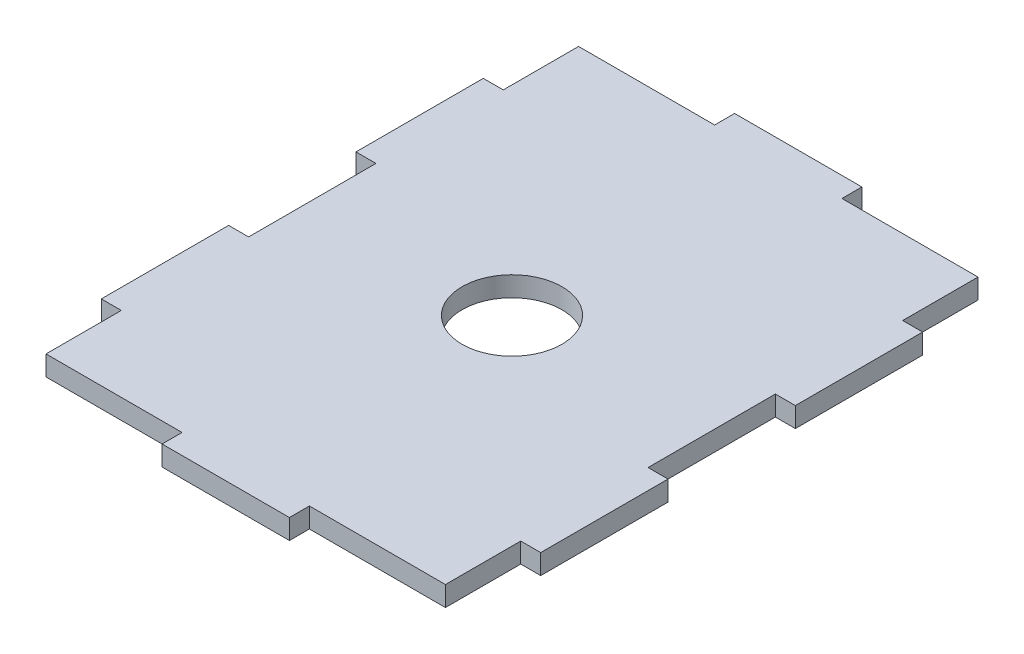
ISO-10303-21;
HEADER;
FILE_DESCRIPTION(('STEP AP214'),'2;1');
FILE_NAME('part.step','',(''),(''),'','','');
FILE_SCHEMA(('AUTOMOTIVE_DESIGN { 1 0 10303 214 1 1 1 1 }'));
ENDSEC;
DATA;
#1=APPLICATION_CONTEXT('core data for automotive mechanical design processes');
#2=APPLICATION_PROTOCOL_DEFINITION('international standard','automotive_design',2000,#1);
#3=PRODUCT_CONTEXT('',#1,'mechanical');
#4=PRODUCT('Part','Part','',(#3));
#5=PRODUCT_RELATED_PRODUCT_CATEGORY('part','',(#4));
#6=PRODUCT_DEFINITION_FORMATION('','',#4);
#7=PRODUCT_DEFINITION_CONTEXT('part definition',#1,'design');
#8=PRODUCT_DEFINITION('design','',#6,#7);
#9=PRODUCT_DEFINITION_SHAPE('','',#8);
#10=(LENGTH_UNIT() NAMED_UNIT(*) SI_UNIT(.MILLI.,.METRE.));
#11=(NAMED_UNIT(*) PLANE_ANGLE_UNIT() SI_UNIT($,.RADIAN.));
#12=(NAMED_UNIT(*) SI_UNIT($,.STERADIAN.) SOLID_ANGLE_UNIT());
#13=UNCERTAINTY_MEASURE_WITH_UNIT(LENGTH_MEASURE(1.E-05),#10,'distance_accuracy_value','');
#14=(GEOMETRIC_REPRESENTATION_CONTEXT(3) GLOBAL_UNCERTAINTY_ASSIGNED_CONTEXT((#13)) GLOBAL_UNIT_ASSIGNED_CONTEXT((#10,
#11,#12)) REPRESENTATION_CONTEXT('',''));
#15=CARTESIAN_POINT('',(0.,0.,0.));
#16=DIRECTION('',(0.,0.,1.));
#17=DIRECTION('',(1.,0.,0.));
#18=AXIS2_PLACEMENT_3D('',#15,#16,#17);
#19=CARTESIAN_POINT('',(0.,3.,0.));
#20=DIRECTION('',(0.,1.,0.));
#21=DIRECTION('',(0.,0.,1.));
#22=AXIS2_PLACEMENT_3D('',#19,#20,#21);
#23=PLANE('',#22);
#24=DIRECTION('',(-1.,0.,0.));
#25=VECTOR('',#24,1.);
#26=CARTESIAN_POINT('',(-12.5730819339896,3.,10.7732061286201));
#27=LINE('',#26,#25);
#28=CARTESIAN_POINT('',(6.55191806601041,3.,10.7732061286201));
#29=VERTEX_POINT('',#28);
#30=CARTESIAN_POINT('',(-13.8855819339896,3.,10.7732061286201));
#31=VERTEX_POINT('',#30);
#32=EDGE_CURVE('E52',#29,#31,#27,.T.);
#33=ORIENTED_EDGE('',*,*,#32,.T.);
#34=DIRECTION('',(0.,0.,1.));
#35=VECTOR('',#34,1.);
#36=CARTESIAN_POINT('',(-13.8855819339896,3.,10.7732061286201));
#37=LINE('',#36,#35);
#38=CARTESIAN_POINT('',(-13.8855819339896,3.,22.0857061286201));
#39=VERTEX_POINT('',#38);
#40=EDGE_CURVE('E156',#31,#39,#37,.T.);
#41=ORIENTED_EDGE('',*,*,#40,.T.);
#42=DIRECTION('',(-1.,0.,0.));
#43=VECTOR('',#42,1.);
#44=CARTESIAN_POINT('',(-13.8855819339896,3.,22.0857061286201));
#45=LINE('',#44,#43);
#46=CARTESIAN_POINT('',(-16.8855819339896,3.,22.0857061286201));
#47=VERTEX_POINT('',#46);
#48=EDGE_CURVE('E385',#39,#47,#45,.T.);
#49=ORIENTED_EDGE('',*,*,#48,.T.);
#50=DIRECTION('',(0.,0.,1.));
#51=VECTOR('',#50,1.);
#52=CARTESIAN_POINT('',(-16.8855819339896,3.,22.0857061286201));
#53=LINE('',#52,#51);
#54=CARTESIAN_POINT('',(-16.8855819339896,3.,41.2107061286201));
#55=VERTEX_POINT('',#54);
#56=EDGE_CURVE('E405',#47,#55,#53,.T.);
#57=ORIENTED_EDGE('',*,*,#56,.T.);
#58=DIRECTION('',(1.,0.,0.));
#59=VECTOR('',#58,1.);
#60=CARTESIAN_POINT('',(-16.8855819339896,3.,41.2107061286201));
#61=LINE('',#60,#59);
#62=CARTESIAN_POINT('',(-13.8855819339896,3.,41.2107061286201));
#63=VERTEX_POINT('',#62);
#64=EDGE_CURVE('E402',#55,#63,#61,.T.);
#65=ORIENTED_EDGE('',*,*,#64,.T.);
#66=DIRECTION('',(0.,0.,1.));
#67=VECTOR('',#66,1.);
#68=CARTESIAN_POINT('',(-13.8855819339896,3.,41.2107061286201));
#69=LINE('',#68,#67);
#70=CARTESIAN_POINT('',(-13.8855819339896,3.,60.3357061286201));
#71=VERTEX_POINT('',#70);
#72=EDGE_CURVE('E404',#63,#71,#69,.T.);
#73=ORIENTED_EDGE('',*,*,#72,.T.);
#74=DIRECTION('',(-1.,0.,0.));
#75=VECTOR('',#74,1.);
#76=CARTESIAN_POINT('',(-13.8855819339896,3.,60.3357061286201));
#77=LINE('',#76,#75);
#78=CARTESIAN_POINT('',(-16.8855819339896,3.,60.3357061286201));
#79=VERTEX_POINT('',#78);
#80=EDGE_CURVE('E407',#71,#79,#77,.T.);
#81=ORIENTED_EDGE('',*,*,#80,.T.);
#82=DIRECTION('',(0.,0.,1.));
#83=VECTOR('',#82,1.);
#84=CARTESIAN_POINT('',(-16.8855819339896,3.,60.3357061286201));
#85=LINE('',#84,#83);
#86=CARTESIAN_POINT('',(-16.8855819339896,3.,79.4607061286201));
#87=VERTEX_POINT('',#86);
#88=EDGE_CURVE('E413',#79,#87,#85,.T.);
#89=ORIENTED_EDGE('',*,*,#88,.T.);
#90=DIRECTION('',(1.,0.,0.));
#91=VECTOR('',#90,1.);
#92=CARTESIAN_POINT('',(-16.8855819339896,3.,79.4607061286201));
#93=LINE('',#92,#91);
#94=CARTESIAN_POINT('',(-13.8855819339896,3.,79.4607061286201));
#95=VERTEX_POINT('',#94);
#96=EDGE_CURVE('E415',#87,#95,#93,.T.);
#97=ORIENTED_EDGE('',*,*,#96,.T.);
#98=DIRECTION('',(0.,0.,1.));
#99=VECTOR('',#98,1.);
#100=CARTESIAN_POINT('',(-13.8855819339896,3.,79.4607061286201));
#101=LINE('',#100,#99);
#102=CARTESIAN_POINT('',(-13.8855819339896,3.,90.7732061286201));
#103=VERTEX_POINT('',#102);
#104=EDGE_CURVE('E417',#95,#103,#101,.T.);
#105=ORIENTED_EDGE('',*,*,#104,.T.);
#106=DIRECTION('',(1.,0.,0.));
#107=VECTOR('',#106,1.);
#108=CARTESIAN_POINT('',(-13.8855819339896,3.,90.7732061286201));
#109=LINE('',#108,#107);
#110=CARTESIAN_POINT('',(6.55191806601041,3.,90.7732061286201));
#111=VERTEX_POINT('',#110);
#112=EDGE_CURVE('E419',#103,#111,#109,.T.);
#113=ORIENTED_EDGE('',*,*,#112,.T.);
#114=DIRECTION('',(0.,0.,1.));
#115=VECTOR('',#114,1.);
#116=CARTESIAN_POINT('',(6.55191806601041,3.,90.7732061286201));
#117=LINE('',#116,#115);
#118=CARTESIAN_POINT('',(6.55191806601041,3.,93.7732061286201));
#119=VERTEX_POINT('',#118);
#120=EDGE_CURVE('E421',#111,#119,#117,.T.);
#121=ORIENTED_EDGE('',*,*,#120,.T.);
#122=DIRECTION('',(1.,0.,0.));
#123=VECTOR('',#122,1.);
#124=CARTESIAN_POINT('',(6.55191806601041,3.,93.7732061286201));
#125=LINE('',#124,#123);
#126=CARTESIAN_POINT('',(25.6769180660104,3.,93.7732061286201));
#127=VERTEX_POINT('',#126);
#128=EDGE_CURVE('E423',#119,#127,#125,.T.);
#129=ORIENTED_EDGE('',*,*,#128,.T.);
#130=DIRECTION('',(0.,0.,-1.));
#131=VECTOR('',#130,1.);
#132=CARTESIAN_POINT('',(25.6769180660104,3.,93.7732061286201));
#133=LINE('',#132,#131);
#134=CARTESIAN_POINT('',(25.6769180660104,3.,90.7732061286201));
#135=VERTEX_POINT('',#134);
#136=EDGE_CURVE('E425',#127,#135,#133,.T.);
#137=ORIENTED_EDGE('',*,*,#136,.T.);
#138=DIRECTION('',(1.,0.,0.));
#139=VECTOR('',#138,1.);
#140=CARTESIAN_POINT('',(25.6769180660104,3.,90.7732061286201));
#141=LINE('',#140,#139);
#142=CARTESIAN_POINT('',(46.1144180660104,3.,90.7732061286201));
#143=VERTEX_POINT('',#142);
#144=EDGE_CURVE('E427',#135,#143,#141,.T.);
#145=ORIENTED_EDGE('',*,*,#144,.T.);
#146=DIRECTION('',(0.,0.,-1.));
#147=VECTOR('',#146,1.);
#148=CARTESIAN_POINT('',(46.1144180660104,3.,90.7732061286201));
#149=LINE('',#148,#147);
#150=CARTESIAN_POINT('',(46.1144180660104,3.,79.4607061286201));
#151=VERTEX_POINT('',#150);
#152=EDGE_CURVE('E429',#143,#151,#149,.T.);
#153=ORIENTED_EDGE('',*,*,#152,.T.);
#154=DIRECTION('',(1.,0.,0.));
#155=VECTOR('',#154,1.);
#156=CARTESIAN_POINT('',(46.1144180660104,3.,79.4607061286201));
#157=LINE('',#156,#155);
#158=CARTESIAN_POINT('',(49.1144180660104,3.,79.4607061286201));
#159=VERTEX_POINT('',#158);
#160=EDGE_CURVE('E431',#151,#159,#157,.T.);
#161=ORIENTED_EDGE('',*,*,#160,.T.);
#162=DIRECTION('',(0.,0.,-1.));
#163=VECTOR('',#162,1.);
#164=CARTESIAN_POINT('',(49.1144180660104,3.,79.4607061286201));
#165=LINE('',#164,#163);
#166=CARTESIAN_POINT('',(49.1144180660104,3.,60.3357061286201));
#167=VERTEX_POINT('',#166);
#168=EDGE_CURVE('E433',#159,#167,#165,.T.);
#169=ORIENTED_EDGE('',*,*,#168,.T.);
#170=DIRECTION('',(-1.,0.,0.));
#171=VECTOR('',#170,1.);
#172=CARTESIAN_POINT('',(49.1144180660104,3.,60.3357061286201));
#173=LINE('',#172,#171);
#174=CARTESIAN_POINT('',(46.1144180660104,3.,60.3357061286201));
#175=VERTEX_POINT('',#174);
#176=EDGE_CURVE('E435',#167,#175,#173,.T.);
#177=ORIENTED_EDGE('',*,*,#176,.T.);
#178=DIRECTION('',(0.,0.,-1.));
#179=VECTOR('',#178,1.);
#180=CARTESIAN_POINT('',(46.1144180660104,3.,60.3357061286201));
#181=LINE('',#180,#179);
#182=CARTESIAN_POINT('',(46.1144180660104,3.,41.2107061286201));
#183=VERTEX_POINT('',#182);
#184=EDGE_CURVE('E437',#175,#183,#181,.T.);
#185=ORIENTED_EDGE('',*,*,#184,.T.);
#186=DIRECTION('',(1.,0.,0.));
#187=VECTOR('',#186,1.);
#188=CARTESIAN_POINT('',(46.1144180660104,3.,41.2107061286201));
#189=LINE('',#188,#187);
#190=CARTESIAN_POINT('',(49.1144180660104,3.,41.2107061286201));
#191=VERTEX_POINT('',#190);
#192=EDGE_CURVE('E439',#183,#191,#189,.T.);
#193=ORIENTED_EDGE('',*,*,#192,.T.);
#194=DIRECTION('',(0.,0.,-1.));
#195=VECTOR('',#194,1.);
#196=CARTESIAN_POINT('',(49.1144180660104,3.,41.2107061286201));
#197=LINE('',#196,#195);
#198=CARTESIAN_POINT('',(49.1144180660104,3.,22.0857061286201));
#199=VERTEX_POINT('',#198);
#200=EDGE_CURVE('E441',#191,#199,#197,.T.);
#201=ORIENTED_EDGE('',*,*,#200,.T.);
#202=DIRECTION('',(-1.,0.,0.));
#203=VECTOR('',#202,1.);
#204=CARTESIAN_POINT('',(49.1144180660104,3.,22.0857061286201));
#205=LINE('',#204,#203);
#206=CARTESIAN_POINT('',(46.1144180660104,3.,22.0857061286201));
#207=VERTEX_POINT('',#206);
#208=EDGE_CURVE('E443',#199,#207,#205,.T.);
#209=ORIENTED_EDGE('',*,*,#208,.T.);
#210=DIRECTION('',(0.,0.,-1.));
#211=VECTOR('',#210,1.);
#212=CARTESIAN_POINT('',(46.1144180660104,3.,22.0857061286201));
#213=LINE('',#212,#211);
#214=CARTESIAN_POINT('',(46.1144180660104,3.,10.7732061286201));
#215=VERTEX_POINT('',#214);
#216=EDGE_CURVE('E445',#207,#215,#213,.T.);
#217=ORIENTED_EDGE('',*,*,#216,.T.);
#218=DIRECTION('',(-1.,0.,0.));
#219=VECTOR('',#218,1.);
#220=CARTESIAN_POINT('',(46.1144180660104,3.,10.7732061286201));
#221=LINE('',#220,#219);
#222=CARTESIAN_POINT('',(25.6769180660104,3.,10.7732061286201));
#223=VERTEX_POINT('',#222);
#224=EDGE_CURVE('E236',#215,#223,#221,.T.);
#225=ORIENTED_EDGE('',*,*,#224,.T.);
#226=DIRECTION('',(0.,0.,-1.));
#227=VECTOR('',#226,1.);
#228=CARTESIAN_POINT('',(25.6769180660104,3.,10.7732061286201));
#229=LINE('',#228,#227);
#230=CARTESIAN_POINT('',(25.6769180660104,3.,7.77320612862015));
#231=VERTEX_POINT('',#230);
#232=EDGE_CURVE('E230',#223,#231,#229,.T.);
#233=ORIENTED_EDGE('',*,*,#232,.T.);
#234=DIRECTION('',(-1.,0.,0.));
#235=VECTOR('',#234,1.);
#236=CARTESIAN_POINT('',(25.6769180660104,3.,7.77320612862015));
#237=LINE('',#236,#235);
#238=CARTESIAN_POINT('',(6.55191806601041,3.,7.77320612862015));
#239=VERTEX_POINT('',#238);
#240=EDGE_CURVE('E234',#231,#239,#237,.T.);
#241=ORIENTED_EDGE('',*,*,#240,.T.);
#242=DIRECTION('',(0.,0.,1.));
#243=VECTOR('',#242,1.);
#244=CARTESIAN_POINT('',(6.55191806601041,3.,7.77320612862015));
#245=LINE('',#244,#243);
#246=EDGE_CURVE('E250',#239,#29,#245,.T.);
#247=ORIENTED_EDGE('',*,*,#246,.T.);
#248=EDGE_LOOP('',(#33,#41,#49,#57,#65,#73,#81,#89,#97,#105,#113,#121,#129,#137,#145,#153,#161,
#169,#177,#185,#193,#201,#209,#217,#225,#233,#241,#247));
#249=FACE_BOUND('',#248,.T.);
#250=CARTESIAN_POINT('',(16.1144180660104,3.,50.7732061286201));
#251=DIRECTION('',(0.,1.,0.));
#252=DIRECTION('',(0.,0.,1.));
#253=AXIS2_PLACEMENT_3D('',#250,#251,#252);
#254=CIRCLE('',#253,7.5);
#255=CARTESIAN_POINT('',(16.1144180660104,3.,58.2732061286201));
#256=VERTEX_POINT('',#255);
#257=EDGE_CURVE('E259',#256,#256,#254,.T.);
#258=ORIENTED_EDGE('',*,*,#257,.F.);
#259=EDGE_LOOP('',(#258));
#260=FACE_BOUND('',#259,.T.);
#261=ADVANCED_FACE('F35',(#249,#260),#23,.T.);
#262=CARTESIAN_POINT('',(0.,0.,0.));
#263=DIRECTION('',(0.,1.,0.));
#264=DIRECTION('',(0.,0.,1.));
#265=AXIS2_PLACEMENT_3D('',#262,#263,#264);
#266=PLANE('',#265);
#267=DIRECTION('',(0.,0.,1.));
#268=VECTOR('',#267,1.);
#269=CARTESIAN_POINT('',(-13.8855819339896,0.,10.7732061286201));
#270=LINE('',#269,#268);
#271=CARTESIAN_POINT('',(-13.8855819339896,0.,10.7732061286201));
#272=VERTEX_POINT('',#271);
#273=CARTESIAN_POINT('',(-13.8855819339896,0.,22.0857061286201));
#274=VERTEX_POINT('',#273);
#275=EDGE_CURVE('E256',#272,#274,#270,.T.);
#276=ORIENTED_EDGE('',*,*,#275,.F.);
#277=DIRECTION('',(-1.,0.,0.));
#278=VECTOR('',#277,1.);
#279=CARTESIAN_POINT('',(6.55191806601041,0.,10.7732061286201));
#280=LINE('',#279,#278);
#281=CARTESIAN_POINT('',(6.55191806601041,0.,10.7732061286201));
#282=VERTEX_POINT('',#281);
#283=EDGE_CURVE('E309',#282,#272,#280,.T.);
#284=ORIENTED_EDGE('',*,*,#283,.F.);
#285=DIRECTION('',(0.,0.,1.));
#286=VECTOR('',#285,1.);
#287=CARTESIAN_POINT('',(6.55191806601041,0.,7.77320612862015));
#288=LINE('',#287,#286);
#289=CARTESIAN_POINT('',(6.55191806601041,0.,7.77320612862015));
#290=VERTEX_POINT('',#289);
#291=EDGE_CURVE('E149',#290,#282,#288,.T.);
#292=ORIENTED_EDGE('',*,*,#291,.F.);
#293=DIRECTION('',(-1.,0.,0.));
#294=VECTOR('',#293,1.);
#295=CARTESIAN_POINT('',(25.6769180660104,0.,7.77320612862015));
#296=LINE('',#295,#294);
#297=CARTESIAN_POINT('',(25.6769180660104,0.,7.77320612862015));
#298=VERTEX_POINT('',#297);
#299=EDGE_CURVE('E142',#298,#290,#296,.T.);
#300=ORIENTED_EDGE('',*,*,#299,.F.);
#301=DIRECTION('',(0.,0.,-1.));
#302=VECTOR('',#301,1.);
#303=CARTESIAN_POINT('',(25.6769180660104,0.,10.7732061286201));
#304=LINE('',#303,#302);
#305=CARTESIAN_POINT('',(25.6769180660104,0.,10.7732061286201));
#306=VERTEX_POINT('',#305);
#307=EDGE_CURVE('E244',#306,#298,#304,.T.);
#308=ORIENTED_EDGE('',*,*,#307,.F.);
#309=DIRECTION('',(-1.,0.,0.));
#310=VECTOR('',#309,1.);
#311=CARTESIAN_POINT('',(46.1144180660104,0.,10.7732061286201));
#312=LINE('',#311,#310);
#313=CARTESIAN_POINT('',(46.1144180660104,0.,10.7732061286201));
#314=VERTEX_POINT('',#313);
#315=EDGE_CURVE('E304',#314,#306,#312,.T.);
#316=ORIENTED_EDGE('',*,*,#315,.F.);
#317=DIRECTION('',(0.,0.,-1.));
#318=VECTOR('',#317,1.);
#319=CARTESIAN_POINT('',(46.1144180660104,0.,22.0857061286201));
#320=LINE('',#319,#318);
#321=CARTESIAN_POINT('',(46.1144180660104,0.,22.0857061286201));
#322=VERTEX_POINT('',#321);
#323=EDGE_CURVE('E302',#322,#314,#320,.T.);
#324=ORIENTED_EDGE('',*,*,#323,.F.);
#325=DIRECTION('',(-1.,0.,0.));
#326=VECTOR('',#325,1.);
#327=CARTESIAN_POINT('',(49.1144180660104,0.,22.0857061286201));
#328=LINE('',#327,#326);
#329=CARTESIAN_POINT('',(49.1144180660104,0.,22.0857061286201));
#330=VERTEX_POINT('',#329);
#331=EDGE_CURVE('E300',#330,#322,#328,.T.);
#332=ORIENTED_EDGE('',*,*,#331,.F.);
#333=DIRECTION('',(0.,0.,-1.));
#334=VECTOR('',#333,1.);
#335=CARTESIAN_POINT('',(49.1144180660104,0.,41.2107061286201));
#336=LINE('',#335,#334);
#337=CARTESIAN_POINT('',(49.1144180660104,0.,41.2107061286201));
#338=VERTEX_POINT('',#337);
#339=EDGE_CURVE('E298',#338,#330,#336,.T.);
#340=ORIENTED_EDGE('',*,*,#339,.F.);
#341=DIRECTION('',(1.,0.,0.));
#342=VECTOR('',#341,1.);
#343=CARTESIAN_POINT('',(46.1144180660104,0.,41.2107061286201));
#344=LINE('',#343,#342);
#345=CARTESIAN_POINT('',(46.1144180660104,0.,41.2107061286201));
#346=VERTEX_POINT('',#345);
#347=EDGE_CURVE('E296',#346,#338,#344,.T.);
#348=ORIENTED_EDGE('',*,*,#347,.F.);
#349=DIRECTION('',(0.,0.,-1.));
#350=VECTOR('',#349,1.);
#351=CARTESIAN_POINT('',(46.1144180660104,0.,60.3357061286201));
#352=LINE('',#351,#350);
#353=CARTESIAN_POINT('',(46.1144180660104,0.,60.3357061286201));
#354=VERTEX_POINT('',#353);
#355=EDGE_CURVE('E294',#354,#346,#352,.T.);
#356=ORIENTED_EDGE('',*,*,#355,.F.);
#357=DIRECTION('',(-1.,0.,0.));
#358=VECTOR('',#357,1.);
#359=CARTESIAN_POINT('',(49.1144180660104,0.,60.3357061286201));
#360=LINE('',#359,#358);
#361=CARTESIAN_POINT('',(49.1144180660104,0.,60.3357061286201));
#362=VERTEX_POINT('',#361);
#363=EDGE_CURVE('E292',#362,#354,#360,.T.);
#364=ORIENTED_EDGE('',*,*,#363,.F.);
#365=DIRECTION('',(0.,0.,-1.));
#366=VECTOR('',#365,1.);
#367=CARTESIAN_POINT('',(49.1144180660104,0.,79.4607061286201));
#368=LINE('',#367,#366);
#369=CARTESIAN_POINT('',(49.1144180660104,0.,79.4607061286201));
#370=VERTEX_POINT('',#369);
#371=EDGE_CURVE('E290',#370,#362,#368,.T.);
#372=ORIENTED_EDGE('',*,*,#371,.F.);
#373=DIRECTION('',(1.,0.,0.));
#374=VECTOR('',#373,1.);
#375=CARTESIAN_POINT('',(46.1144180660104,0.,79.4607061286201));
#376=LINE('',#375,#374);
#377=CARTESIAN_POINT('',(46.1144180660104,0.,79.4607061286201));
#378=VERTEX_POINT('',#377);
#379=EDGE_CURVE('E288',#378,#370,#376,.T.);
#380=ORIENTED_EDGE('',*,*,#379,.F.);
#381=DIRECTION('',(0.,0.,-1.));
#382=VECTOR('',#381,1.);
#383=CARTESIAN_POINT('',(46.1144180660104,0.,90.7732061286201));
#384=LINE('',#383,#382);
#385=CARTESIAN_POINT('',(46.1144180660104,0.,90.7732061286201));
#386=VERTEX_POINT('',#385);
#387=EDGE_CURVE('E286',#386,#378,#384,.T.);
#388=ORIENTED_EDGE('',*,*,#387,.F.);
#389=DIRECTION('',(1.,0.,0.));
#390=VECTOR('',#389,1.);
#391=CARTESIAN_POINT('',(44.8019180660104,0.,90.7732061286201));
#392=LINE('',#391,#390);
#393=CARTESIAN_POINT('',(25.6769180660104,0.,90.7732061286201));
#394=VERTEX_POINT('',#393);
#395=EDGE_CURVE('E284',#394,#386,#392,.T.);
#396=ORIENTED_EDGE('',*,*,#395,.F.);
#397=DIRECTION('',(0.,0.,-1.));
#398=VECTOR('',#397,1.);
#399=CARTESIAN_POINT('',(25.6769180660104,0.,93.7732061286201));
#400=LINE('',#399,#398);
#401=CARTESIAN_POINT('',(25.6769180660104,0.,93.7732061286201));
#402=VERTEX_POINT('',#401);
#403=EDGE_CURVE('E281',#402,#394,#400,.T.);
#404=ORIENTED_EDGE('',*,*,#403,.F.);
#405=DIRECTION('',(1.,0.,0.));
#406=VECTOR('',#405,1.);
#407=CARTESIAN_POINT('',(6.55191806601041,0.,93.7732061286201));
#408=LINE('',#407,#406);
#409=CARTESIAN_POINT('',(6.55191806601041,0.,93.7732061286201));
#410=VERTEX_POINT('',#409);
#411=EDGE_CURVE('E279',#410,#402,#408,.T.);
#412=ORIENTED_EDGE('',*,*,#411,.F.);
#413=DIRECTION('',(0.,0.,1.));
#414=VECTOR('',#413,1.);
#415=CARTESIAN_POINT('',(6.55191806601041,0.,90.7732061286201));
#416=LINE('',#415,#414);
#417=CARTESIAN_POINT('',(6.55191806601041,0.,90.7732061286201));
#418=VERTEX_POINT('',#417);
#419=EDGE_CURVE('E277',#418,#410,#416,.T.);
#420=ORIENTED_EDGE('',*,*,#419,.F.);
#421=DIRECTION('',(1.,0.,0.));
#422=VECTOR('',#421,1.);
#423=CARTESIAN_POINT('',(-13.8855819339896,0.,90.7732061286201));
#424=LINE('',#423,#422);
#425=CARTESIAN_POINT('',(-13.8855819339896,0.,90.7732061286201));
#426=VERTEX_POINT('',#425);
#427=EDGE_CURVE('E275',#426,#418,#424,.T.);
#428=ORIENTED_EDGE('',*,*,#427,.F.);
#429=DIRECTION('',(0.,0.,1.));
#430=VECTOR('',#429,1.);
#431=CARTESIAN_POINT('',(-13.8855819339896,0.,79.4607061286201));
#432=LINE('',#431,#430);
#433=CARTESIAN_POINT('',(-13.8855819339896,0.,79.4607061286201));
#434=VERTEX_POINT('',#433);
#435=EDGE_CURVE('E273',#434,#426,#432,.T.);
#436=ORIENTED_EDGE('',*,*,#435,.F.);
#437=DIRECTION('',(1.,0.,0.));
#438=VECTOR('',#437,1.);
#439=CARTESIAN_POINT('',(-16.8855819339896,0.,79.4607061286201));
#440=LINE('',#439,#438);
#441=CARTESIAN_POINT('',(-16.8855819339896,0.,79.4607061286201));
#442=VERTEX_POINT('',#441);
#443=EDGE_CURVE('E271',#442,#434,#440,.T.);
#444=ORIENTED_EDGE('',*,*,#443,.F.);
#445=DIRECTION('',(0.,0.,1.));
#446=VECTOR('',#445,1.);
#447=CARTESIAN_POINT('',(-16.8855819339896,0.,60.3357061286201));
#448=LINE('',#447,#446);
#449=CARTESIAN_POINT('',(-16.8855819339896,0.,60.3357061286201));
#450=VERTEX_POINT('',#449);
#451=EDGE_CURVE('E269',#450,#442,#448,.T.);
#452=ORIENTED_EDGE('',*,*,#451,.F.);
#453=DIRECTION('',(-1.,0.,0.));
#454=VECTOR('',#453,1.);
#455=CARTESIAN_POINT('',(-13.8855819339896,0.,60.3357061286201));
#456=LINE('',#455,#454);
#457=CARTESIAN_POINT('',(-13.8855819339896,0.,60.3357061286201));
#458=VERTEX_POINT('',#457);
#459=EDGE_CURVE('E267',#458,#450,#456,.T.);
#460=ORIENTED_EDGE('',*,*,#459,.F.);
#461=DIRECTION('',(0.,0.,1.));
#462=VECTOR('',#461,1.);
#463=CARTESIAN_POINT('',(-13.8855819339896,0.,41.2107061286201));
#464=LINE('',#463,#462);
#465=CARTESIAN_POINT('',(-13.8855819339896,0.,41.2107061286201));
#466=VERTEX_POINT('',#465);
#467=EDGE_CURVE('E265',#466,#458,#464,.T.);
#468=ORIENTED_EDGE('',*,*,#467,.F.);
#469=DIRECTION('',(1.,0.,0.));
#470=VECTOR('',#469,1.);
#471=CARTESIAN_POINT('',(-16.8855819339896,0.,41.2107061286201));
#472=LINE('',#471,#470);
#473=CARTESIAN_POINT('',(-16.8855819339896,0.,41.2107061286201));
#474=VERTEX_POINT('',#473);
#475=EDGE_CURVE('E263',#474,#466,#472,.T.);
#476=ORIENTED_EDGE('',*,*,#475,.F.);
#477=DIRECTION('',(0.,0.,1.));
#478=VECTOR('',#477,1.);
#479=CARTESIAN_POINT('',(-16.8855819339896,0.,22.0857061286201));
#480=LINE('',#479,#478);
#481=CARTESIAN_POINT('',(-16.8855819339896,0.,22.0857061286201));
#482=VERTEX_POINT('',#481);
#483=EDGE_CURVE('E261',#482,#474,#480,.T.);
#484=ORIENTED_EDGE('',*,*,#483,.F.);
#485=DIRECTION('',(-1.,0.,0.));
#486=VECTOR('',#485,1.);
#487=CARTESIAN_POINT('',(-13.8855819339896,0.,22.0857061286201));
#488=LINE('',#487,#486);
#489=EDGE_CURVE('E258',#274,#482,#488,.T.);
#490=ORIENTED_EDGE('',*,*,#489,.F.);
#491=EDGE_LOOP('',(#276,#284,#292,#300,#308,#316,#324,#332,#340,#348,#356,#364,#372,#380,#388,
#396,#404,#412,#420,#428,#436,#444,#452,#460,#468,#476,#484,#490));
#492=FACE_BOUND('',#491,.T.);
#493=CARTESIAN_POINT('',(16.1144180660104,0.,50.7732061286201));
#494=DIRECTION('',(0.,1.,0.));
#495=DIRECTION('',(0.,0.,1.));
#496=AXIS2_PLACEMENT_3D('',#493,#494,#495);
#497=CIRCLE('',#496,7.5);
#498=CARTESIAN_POINT('',(16.1144180660104,0.,58.2732061286201));
#499=VERTEX_POINT('',#498);
#500=EDGE_CURVE('E461',#499,#499,#497,.T.);
#501=ORIENTED_EDGE('',*,*,#500,.T.);
#502=EDGE_LOOP('',(#501));
#503=FACE_BOUND('',#502,.T.);
#504=ADVANCED_FACE('F389',(#492,#503),#266,.F.);
#505=CARTESIAN_POINT('',(-13.8855819339896,3.,10.7732061286201));
#506=DIRECTION('',(1.,0.,0.));
#507=DIRECTION('',(0.,0.,-1.));
#508=AXIS2_PLACEMENT_3D('',#505,#506,#507);
#509=PLANE('',#508);
#510=ORIENTED_EDGE('',*,*,#275,.T.);
#511=DIRECTION('',(0.,-1.,0.));
#512=VECTOR('',#511,1.);
#513=CARTESIAN_POINT('',(-13.8855819339896,3.,22.0857061286201));
#514=LINE('',#513,#512);
#515=EDGE_CURVE('E44',#39,#274,#514,.T.);
#516=ORIENTED_EDGE('',*,*,#515,.F.);
#517=ORIENTED_EDGE('',*,*,#40,.F.);
#518=DIRECTION('',(0.,-1.,0.));
#519=VECTOR('',#518,1.);
#520=CARTESIAN_POINT('',(-13.8855819339896,3.,10.7732061286201));
#521=LINE('',#520,#519);
#522=EDGE_CURVE('E11',#31,#272,#521,.T.);
#523=ORIENTED_EDGE('',*,*,#522,.T.);
#524=EDGE_LOOP('',(#510,#516,#517,#523));
#525=FACE_BOUND('',#524,.T.);
#526=ADVANCED_FACE('F37',(#525),#509,.F.);
#527=CARTESIAN_POINT('',(-13.8855819339896,3.,22.0857061286201));
#528=DIRECTION('',(0.,0.,1.));
#529=DIRECTION('',(1.,0.,0.));
#530=AXIS2_PLACEMENT_3D('',#527,#528,#529);
#531=PLANE('',#530);
#532=ORIENTED_EDGE('',*,*,#489,.T.);
#533=DIRECTION('',(0.,-1.,0.));
#534=VECTOR('',#533,1.);
#535=CARTESIAN_POINT('',(-16.8855819339896,3.,22.0857061286201));
#536=LINE('',#535,#534);
#537=EDGE_CURVE('E377',#47,#482,#536,.T.);
#538=ORIENTED_EDGE('',*,*,#537,.F.);
#539=ORIENTED_EDGE('',*,*,#48,.F.);
#540=ORIENTED_EDGE('',*,*,#515,.T.);
#541=EDGE_LOOP('',(#532,#538,#539,#540));
#542=FACE_BOUND('',#541,.T.);
#543=ADVANCED_FACE('F383',(#542),#531,.F.);
#544=CARTESIAN_POINT('',(-16.8855819339896,3.,22.0857061286201));
#545=DIRECTION('',(1.,0.,0.));
#546=DIRECTION('',(0.,0.,-1.));
#547=AXIS2_PLACEMENT_3D('',#544,#545,#546);
#548=PLANE('',#547);
#549=ORIENTED_EDGE('',*,*,#483,.T.);
#550=DIRECTION('',(0.,-1.,0.));
#551=VECTOR('',#550,1.);
#552=CARTESIAN_POINT('',(-16.8855819339896,3.,41.2107061286201));
#553=LINE('',#552,#551);
#554=EDGE_CURVE('E374',#55,#474,#553,.T.);
#555=ORIENTED_EDGE('',*,*,#554,.F.);
#556=ORIENTED_EDGE('',*,*,#56,.F.);
#557=ORIENTED_EDGE('',*,*,#537,.T.);
#558=EDGE_LOOP('',(#549,#555,#556,#557));
#559=FACE_BOUND('',#558,.T.);
#560=ADVANCED_FACE('F396',(#559),#548,.F.);
#561=CARTESIAN_POINT('',(-16.8855819339896,3.,41.2107061286201));
#562=DIRECTION('',(0.,0.,-1.));
#563=DIRECTION('',(-1.,0.,0.));
#564=AXIS2_PLACEMENT_3D('',#561,#562,#563);
#565=PLANE('',#564);
#566=ORIENTED_EDGE('',*,*,#475,.T.);
#567=DIRECTION('',(0.,-1.,0.));
#568=VECTOR('',#567,1.);
#569=CARTESIAN_POINT('',(-13.8855819339896,3.,41.2107061286201));
#570=LINE('',#569,#568);
#571=EDGE_CURVE('E371',#63,#466,#570,.T.);
#572=ORIENTED_EDGE('',*,*,#571,.F.);
#573=ORIENTED_EDGE('',*,*,#64,.F.);
#574=ORIENTED_EDGE('',*,*,#554,.T.);
#575=EDGE_LOOP('',(#566,#572,#573,#574));
#576=FACE_BOUND('',#575,.T.);
#577=ADVANCED_FACE('F400',(#576),#565,.F.);
#578=CARTESIAN_POINT('',(-13.8855819339896,3.,41.2107061286201));
#579=DIRECTION('',(1.,0.,0.));
#580=DIRECTION('',(0.,0.,-1.));
#581=AXIS2_PLACEMENT_3D('',#578,#579,#580);
#582=PLANE('',#581);
#583=ORIENTED_EDGE('',*,*,#467,.T.);
#584=DIRECTION('',(0.,-1.,0.));
#585=VECTOR('',#584,1.);
#586=CARTESIAN_POINT('',(-13.8855819339896,3.,60.3357061286201));
#587=LINE('',#586,#585);
#588=EDGE_CURVE('E368',#71,#458,#587,.T.);
#589=ORIENTED_EDGE('',*,*,#588,.F.);
#590=ORIENTED_EDGE('',*,*,#72,.F.);
#591=ORIENTED_EDGE('',*,*,#571,.T.);
#592=EDGE_LOOP('',(#583,#589,#590,#591));
#593=FACE_BOUND('',#592,.T.);
#594=ADVANCED_FACE('F556',(#593),#582,.F.);
#595=CARTESIAN_POINT('',(-13.8855819339896,3.,60.3357061286201));
#596=DIRECTION('',(0.,0.,1.));
#597=DIRECTION('',(1.,0.,0.));
#598=AXIS2_PLACEMENT_3D('',#595,#596,#597);
#599=PLANE('',#598);
#600=ORIENTED_EDGE('',*,*,#459,.T.);
#601=DIRECTION('',(0.,-1.,0.));
#602=VECTOR('',#601,1.);
#603=CARTESIAN_POINT('',(-16.8855819339896,3.,60.3357061286201));
#604=LINE('',#603,#602);
#605=EDGE_CURVE('E365',#79,#450,#604,.T.);
#606=ORIENTED_EDGE('',*,*,#605,.F.);
#607=ORIENTED_EDGE('',*,*,#80,.F.);
#608=ORIENTED_EDGE('',*,*,#588,.T.);
#609=EDGE_LOOP('',(#600,#606,#607,#608));
#610=FACE_BOUND('',#609,.T.);
#611=ADVANCED_FACE('F552',(#610),#599,.F.);
#612=CARTESIAN_POINT('',(-16.8855819339896,3.,60.3357061286201));
#613=DIRECTION('',(1.,0.,0.));
#614=DIRECTION('',(0.,0.,-1.));
#615=AXIS2_PLACEMENT_3D('',#612,#613,#614);
#616=PLANE('',#615);
#617=ORIENTED_EDGE('',*,*,#451,.T.);
#618=DIRECTION('',(0.,-1.,0.));
#619=VECTOR('',#618,1.);
#620=CARTESIAN_POINT('',(-16.8855819339896,3.,79.4607061286201));
#621=LINE('',#620,#619);
#622=EDGE_CURVE('E362',#87,#442,#621,.T.);
#623=ORIENTED_EDGE('',*,*,#622,.F.);
#624=ORIENTED_EDGE('',*,*,#88,.F.);
#625=ORIENTED_EDGE('',*,*,#605,.T.);
#626=EDGE_LOOP('',(#617,#623,#624,#625));
#627=FACE_BOUND('',#626,.T.);
#628=ADVANCED_FACE('F548',(#627),#616,.F.);
#629=CARTESIAN_POINT('',(-16.8855819339896,3.,79.4607061286201));
#630=DIRECTION('',(0.,0.,-1.));
#631=DIRECTION('',(-1.,0.,0.));
#632=AXIS2_PLACEMENT_3D('',#629,#630,#631);
#633=PLANE('',#632);
#634=ORIENTED_EDGE('',*,*,#443,.T.);
#635=DIRECTION('',(0.,-1.,0.));
#636=VECTOR('',#635,1.);
#637=CARTESIAN_POINT('',(-13.8855819339896,3.,79.4607061286201));
#638=LINE('',#637,#636);
#639=EDGE_CURVE('E359',#95,#434,#638,.T.);
#640=ORIENTED_EDGE('',*,*,#639,.F.);
#641=ORIENTED_EDGE('',*,*,#96,.F.);
#642=ORIENTED_EDGE('',*,*,#622,.T.);
#643=EDGE_LOOP('',(#634,#640,#641,#642));
#644=FACE_BOUND('',#643,.T.);
#645=ADVANCED_FACE('F544',(#644),#633,.F.);
#646=CARTESIAN_POINT('',(-13.8855819339896,3.,79.4607061286201));
#647=DIRECTION('',(1.,0.,0.));
#648=DIRECTION('',(0.,0.,-1.));
#649=AXIS2_PLACEMENT_3D('',#646,#647,#648);
#650=PLANE('',#649);
#651=ORIENTED_EDGE('',*,*,#435,.T.);
#652=DIRECTION('',(0.,-1.,0.));
#653=VECTOR('',#652,1.);
#654=CARTESIAN_POINT('',(-13.8855819339896,3.,90.7732061286201));
#655=LINE('',#654,#653);
#656=EDGE_CURVE('E356',#103,#426,#655,.T.);
#657=ORIENTED_EDGE('',*,*,#656,.F.);
#658=ORIENTED_EDGE('',*,*,#104,.F.);
#659=ORIENTED_EDGE('',*,*,#639,.T.);
#660=EDGE_LOOP('',(#651,#657,#658,#659));
#661=FACE_BOUND('',#660,.T.);
#662=ADVANCED_FACE('F540',(#661),#650,.F.);
#663=CARTESIAN_POINT('',(-13.8855819339896,3.,90.7732061286201));
#664=DIRECTION('',(0.,0.,-1.));
#665=DIRECTION('',(-1.,0.,0.));
#666=AXIS2_PLACEMENT_3D('',#663,#664,#665);
#667=PLANE('',#666);
#668=ORIENTED_EDGE('',*,*,#427,.T.);
#669=DIRECTION('',(0.,-1.,0.));
#670=VECTOR('',#669,1.);
#671=CARTESIAN_POINT('',(6.55191806601041,3.,90.7732061286201));
#672=LINE('',#671,#670);
#673=EDGE_CURVE('E353',#111,#418,#672,.T.);
#674=ORIENTED_EDGE('',*,*,#673,.F.);
#675=ORIENTED_EDGE('',*,*,#112,.F.);
#676=ORIENTED_EDGE('',*,*,#656,.T.);
#677=EDGE_LOOP('',(#668,#674,#675,#676));
#678=FACE_BOUND('',#677,.T.);
#679=ADVANCED_FACE('F536',(#678),#667,.F.);
#680=CARTESIAN_POINT('',(6.55191806601041,3.,90.7732061286201));
#681=DIRECTION('',(1.,0.,0.));
#682=DIRECTION('',(0.,0.,-1.));
#683=AXIS2_PLACEMENT_3D('',#680,#681,#682);
#684=PLANE('',#683);
#685=ORIENTED_EDGE('',*,*,#419,.T.);
#686=DIRECTION('',(0.,-1.,0.));
#687=VECTOR('',#686,1.);
#688=CARTESIAN_POINT('',(6.55191806601041,3.,93.7732061286201));
#689=LINE('',#688,#687);
#690=EDGE_CURVE('E350',#119,#410,#689,.T.);
#691=ORIENTED_EDGE('',*,*,#690,.F.);
#692=ORIENTED_EDGE('',*,*,#120,.F.);
#693=ORIENTED_EDGE('',*,*,#673,.T.);
#694=EDGE_LOOP('',(#685,#691,#692,#693));
#695=FACE_BOUND('',#694,.T.);
#696=ADVANCED_FACE('F532',(#695),#684,.F.);
#697=CARTESIAN_POINT('',(6.55191806601041,3.,93.7732061286201));
#698=DIRECTION('',(0.,0.,-1.));
#699=DIRECTION('',(-1.,0.,0.));
#700=AXIS2_PLACEMENT_3D('',#697,#698,#699);
#701=PLANE('',#700);
#702=ORIENTED_EDGE('',*,*,#411,.T.);
#703=DIRECTION('',(0.,-1.,0.));
#704=VECTOR('',#703,1.);
#705=CARTESIAN_POINT('',(25.6769180660104,3.,93.7732061286201));
#706=LINE('',#705,#704);
#707=EDGE_CURVE('E347',#127,#402,#706,.T.);
#708=ORIENTED_EDGE('',*,*,#707,.F.);
#709=ORIENTED_EDGE('',*,*,#128,.F.);
#710=ORIENTED_EDGE('',*,*,#690,.T.);
#711=EDGE_LOOP('',(#702,#708,#709,#710));
#712=FACE_BOUND('',#711,.T.);
#713=ADVANCED_FACE('F528',(#712),#701,.F.);
#714=CARTESIAN_POINT('',(25.6769180660104,3.,93.7732061286201));
#715=DIRECTION('',(-1.,0.,0.));
#716=DIRECTION('',(0.,0.,1.));
#717=AXIS2_PLACEMENT_3D('',#714,#715,#716);
#718=PLANE('',#717);
#719=ORIENTED_EDGE('',*,*,#403,.T.);
#720=DIRECTION('',(0.,-1.,0.));
#721=VECTOR('',#720,1.);
#722=CARTESIAN_POINT('',(25.6769180660104,3.,90.7732061286201));
#723=LINE('',#722,#721);
#724=EDGE_CURVE('E344',#135,#394,#723,.T.);
#725=ORIENTED_EDGE('',*,*,#724,.F.);
#726=ORIENTED_EDGE('',*,*,#136,.F.);
#727=ORIENTED_EDGE('',*,*,#707,.T.);
#728=EDGE_LOOP('',(#719,#725,#726,#727));
#729=FACE_BOUND('',#728,.T.);
#730=ADVANCED_FACE('F524',(#729),#718,.F.);
#731=CARTESIAN_POINT('',(44.8019180660104,3.,90.7732061286201));
#732=DIRECTION('',(0.,0.,-1.));
#733=DIRECTION('',(-1.,0.,0.));
#734=AXIS2_PLACEMENT_3D('',#731,#732,#733);
#735=PLANE('',#734);
#736=ORIENTED_EDGE('',*,*,#395,.T.);
#737=DIRECTION('',(0.,-1.,0.));
#738=VECTOR('',#737,1.);
#739=CARTESIAN_POINT('',(46.1144180660104,3.,90.7732061286201));
#740=LINE('',#739,#738);
#741=EDGE_CURVE('E341',#143,#386,#740,.T.);
#742=ORIENTED_EDGE('',*,*,#741,.F.);
#743=ORIENTED_EDGE('',*,*,#144,.F.);
#744=ORIENTED_EDGE('',*,*,#724,.T.);
#745=EDGE_LOOP('',(#736,#742,#743,#744));
#746=FACE_BOUND('',#745,.T.);
#747=ADVANCED_FACE('F520',(#746),#735,.F.);
#748=CARTESIAN_POINT('',(46.1144180660104,3.,90.7732061286201));
#749=DIRECTION('',(-1.,0.,0.));
#750=DIRECTION('',(0.,0.,1.));
#751=AXIS2_PLACEMENT_3D('',#748,#749,#750);
#752=PLANE('',#751);
#753=ORIENTED_EDGE('',*,*,#387,.T.);
#754=DIRECTION('',(0.,-1.,0.));
#755=VECTOR('',#754,1.);
#756=CARTESIAN_POINT('',(46.1144180660104,3.,79.4607061286201));
#757=LINE('',#756,#755);
#758=EDGE_CURVE('E338',#151,#378,#757,.T.);
#759=ORIENTED_EDGE('',*,*,#758,.F.);
#760=ORIENTED_EDGE('',*,*,#152,.F.);
#761=ORIENTED_EDGE('',*,*,#741,.T.);
#762=EDGE_LOOP('',(#753,#759,#760,#761));
#763=FACE_BOUND('',#762,.T.);
#764=ADVANCED_FACE('F516',(#763),#752,.F.);
#765=CARTESIAN_POINT('',(46.1144180660104,3.,79.4607061286201));
#766=DIRECTION('',(0.,0.,-1.));
#767=DIRECTION('',(-1.,0.,0.));
#768=AXIS2_PLACEMENT_3D('',#765,#766,#767);
#769=PLANE('',#768);
#770=ORIENTED_EDGE('',*,*,#379,.T.);
#771=DIRECTION('',(0.,-1.,0.));
#772=VECTOR('',#771,1.);
#773=CARTESIAN_POINT('',(49.1144180660104,3.,79.4607061286201));
#774=LINE('',#773,#772);
#775=EDGE_CURVE('E335',#159,#370,#774,.T.);
#776=ORIENTED_EDGE('',*,*,#775,.F.);
#777=ORIENTED_EDGE('',*,*,#160,.F.);
#778=ORIENTED_EDGE('',*,*,#758,.T.);
#779=EDGE_LOOP('',(#770,#776,#777,#778));
#780=FACE_BOUND('',#779,.T.);
#781=ADVANCED_FACE('F512',(#780),#769,.F.);
#782=CARTESIAN_POINT('',(49.1144180660104,3.,79.4607061286201));
#783=DIRECTION('',(-1.,0.,0.));
#784=DIRECTION('',(0.,0.,1.));
#785=AXIS2_PLACEMENT_3D('',#782,#783,#784);
#786=PLANE('',#785);
#787=ORIENTED_EDGE('',*,*,#371,.T.);
#788=DIRECTION('',(0.,-1.,0.));
#789=VECTOR('',#788,1.);
#790=CARTESIAN_POINT('',(49.1144180660104,3.,60.3357061286201));
#791=LINE('',#790,#789);
#792=EDGE_CURVE('E332',#167,#362,#791,.T.);
#793=ORIENTED_EDGE('',*,*,#792,.F.);
#794=ORIENTED_EDGE('',*,*,#168,.F.);
#795=ORIENTED_EDGE('',*,*,#775,.T.);
#796=EDGE_LOOP('',(#787,#793,#794,#795));
#797=FACE_BOUND('',#796,.T.);
#798=ADVANCED_FACE('F508',(#797),#786,.F.);
#799=CARTESIAN_POINT('',(49.1144180660104,3.,60.3357061286201));
#800=DIRECTION('',(0.,0.,1.));
#801=DIRECTION('',(1.,0.,0.));
#802=AXIS2_PLACEMENT_3D('',#799,#800,#801);
#803=PLANE('',#802);
#804=ORIENTED_EDGE('',*,*,#363,.T.);
#805=DIRECTION('',(0.,-1.,0.));
#806=VECTOR('',#805,1.);
#807=CARTESIAN_POINT('',(46.1144180660104,3.,60.3357061286201));
#808=LINE('',#807,#806);
#809=EDGE_CURVE('E329',#175,#354,#808,.T.);
#810=ORIENTED_EDGE('',*,*,#809,.F.);
#811=ORIENTED_EDGE('',*,*,#176,.F.);
#812=ORIENTED_EDGE('',*,*,#792,.T.);
#813=EDGE_LOOP('',(#804,#810,#811,#812));
#814=FACE_BOUND('',#813,.T.);
#815=ADVANCED_FACE('F504',(#814),#803,.F.);
#816=CARTESIAN_POINT('',(46.1144180660104,3.,60.3357061286201));
#817=DIRECTION('',(-1.,0.,0.));
#818=DIRECTION('',(0.,0.,1.));
#819=AXIS2_PLACEMENT_3D('',#816,#817,#818);
#820=PLANE('',#819);
#821=ORIENTED_EDGE('',*,*,#355,.T.);
#822=DIRECTION('',(0.,-1.,0.));
#823=VECTOR('',#822,1.);
#824=CARTESIAN_POINT('',(46.1144180660104,3.,41.2107061286201));
#825=LINE('',#824,#823);
#826=EDGE_CURVE('E326',#183,#346,#825,.T.);
#827=ORIENTED_EDGE('',*,*,#826,.F.);
#828=ORIENTED_EDGE('',*,*,#184,.F.);
#829=ORIENTED_EDGE('',*,*,#809,.T.);
#830=EDGE_LOOP('',(#821,#827,#828,#829));
#831=FACE_BOUND('',#830,.T.);
#832=ADVANCED_FACE('F500',(#831),#820,.F.);
#833=CARTESIAN_POINT('',(46.1144180660104,3.,41.2107061286201));
#834=DIRECTION('',(0.,0.,-1.));
#835=DIRECTION('',(-1.,0.,0.));
#836=AXIS2_PLACEMENT_3D('',#833,#834,#835);
#837=PLANE('',#836);
#838=ORIENTED_EDGE('',*,*,#347,.T.);
#839=DIRECTION('',(0.,-1.,0.));
#840=VECTOR('',#839,1.);
#841=CARTESIAN_POINT('',(49.1144180660104,3.,41.2107061286201));
#842=LINE('',#841,#840);
#843=EDGE_CURVE('E323',#191,#338,#842,.T.);
#844=ORIENTED_EDGE('',*,*,#843,.F.);
#845=ORIENTED_EDGE('',*,*,#192,.F.);
#846=ORIENTED_EDGE('',*,*,#826,.T.);
#847=EDGE_LOOP('',(#838,#844,#845,#846));
#848=FACE_BOUND('',#847,.T.);
#849=ADVANCED_FACE('F496',(#848),#837,.F.);
#850=CARTESIAN_POINT('',(49.1144180660104,3.,41.2107061286201));
#851=DIRECTION('',(-1.,0.,0.));
#852=DIRECTION('',(0.,0.,1.));
#853=AXIS2_PLACEMENT_3D('',#850,#851,#852);
#854=PLANE('',#853);
#855=ORIENTED_EDGE('',*,*,#339,.T.);
#856=DIRECTION('',(0.,-1.,0.));
#857=VECTOR('',#856,1.);
#858=CARTESIAN_POINT('',(49.1144180660104,3.,22.0857061286201));
#859=LINE('',#858,#857);
#860=EDGE_CURVE('E320',#199,#330,#859,.T.);
#861=ORIENTED_EDGE('',*,*,#860,.F.);
#862=ORIENTED_EDGE('',*,*,#200,.F.);
#863=ORIENTED_EDGE('',*,*,#843,.T.);
#864=EDGE_LOOP('',(#855,#861,#862,#863));
#865=FACE_BOUND('',#864,.T.);
#866=ADVANCED_FACE('F492',(#865),#854,.F.);
#867=CARTESIAN_POINT('',(49.1144180660104,3.,22.0857061286201));
#868=DIRECTION('',(0.,0.,1.));
#869=DIRECTION('',(1.,0.,0.));
#870=AXIS2_PLACEMENT_3D('',#867,#868,#869);
#871=PLANE('',#870);
#872=ORIENTED_EDGE('',*,*,#331,.T.);
#873=DIRECTION('',(0.,-1.,0.));
#874=VECTOR('',#873,1.);
#875=CARTESIAN_POINT('',(46.1144180660104,3.,22.0857061286201));
#876=LINE('',#875,#874);
#877=EDGE_CURVE('E317',#207,#322,#876,.T.);
#878=ORIENTED_EDGE('',*,*,#877,.F.);
#879=ORIENTED_EDGE('',*,*,#208,.F.);
#880=ORIENTED_EDGE('',*,*,#860,.T.);
#881=EDGE_LOOP('',(#872,#878,#879,#880));
#882=FACE_BOUND('',#881,.T.);
#883=ADVANCED_FACE('F489',(#882),#871,.F.);
#884=CARTESIAN_POINT('',(46.1144180660104,3.,22.0857061286201));
#885=DIRECTION('',(-1.,0.,0.));
#886=DIRECTION('',(0.,0.,1.));
#887=AXIS2_PLACEMENT_3D('',#884,#885,#886);
#888=PLANE('',#887);
#889=ORIENTED_EDGE('',*,*,#323,.T.);
#890=DIRECTION('',(0.,-1.,0.));
#891=VECTOR('',#890,1.);
#892=CARTESIAN_POINT('',(46.1144180660104,3.,10.7732061286201));
#893=LINE('',#892,#891);
#894=EDGE_CURVE('E314',#215,#314,#893,.T.);
#895=ORIENTED_EDGE('',*,*,#894,.F.);
#896=ORIENTED_EDGE('',*,*,#216,.F.);
#897=ORIENTED_EDGE('',*,*,#877,.T.);
#898=EDGE_LOOP('',(#889,#895,#896,#897));
#899=FACE_BOUND('',#898,.T.);
#900=ADVANCED_FACE('F451',(#899),#888,.F.);
#901=CARTESIAN_POINT('',(46.1144180660104,3.,10.7732061286201));
#902=DIRECTION('',(0.,0.,1.));
#903=DIRECTION('',(1.,0.,0.));
#904=AXIS2_PLACEMENT_3D('',#901,#902,#903);
#905=PLANE('',#904);
#906=ORIENTED_EDGE('',*,*,#315,.T.);
#907=DIRECTION('',(0.,-1.,0.));
#908=VECTOR('',#907,1.);
#909=CARTESIAN_POINT('',(25.6769180660104,3.,10.7732061286201));
#910=LINE('',#909,#908);
#911=EDGE_CURVE('E245',#223,#306,#910,.T.);
#912=ORIENTED_EDGE('',*,*,#911,.F.);
#913=ORIENTED_EDGE('',*,*,#224,.F.);
#914=ORIENTED_EDGE('',*,*,#894,.T.);
#915=EDGE_LOOP('',(#906,#912,#913,#914));
#916=FACE_BOUND('',#915,.T.);
#917=ADVANCED_FACE('F455',(#916),#905,.F.);
#918=CARTESIAN_POINT('',(25.6769180660104,3.,10.7732061286201));
#919=DIRECTION('',(-1.,0.,0.));
#920=DIRECTION('',(0.,0.,1.));
#921=AXIS2_PLACEMENT_3D('',#918,#919,#920);
#922=PLANE('',#921);
#923=ORIENTED_EDGE('',*,*,#307,.T.);
#924=DIRECTION('',(0.,-1.,0.));
#925=VECTOR('',#924,1.);
#926=CARTESIAN_POINT('',(25.6769180660104,3.,7.77320612862015));
#927=LINE('',#926,#925);
#928=EDGE_CURVE('E241',#231,#298,#927,.T.);
#929=ORIENTED_EDGE('',*,*,#928,.F.);
#930=ORIENTED_EDGE('',*,*,#232,.F.);
#931=ORIENTED_EDGE('',*,*,#911,.T.);
#932=EDGE_LOOP('',(#923,#929,#930,#931));
#933=FACE_BOUND('',#932,.T.);
#934=ADVANCED_FACE('F242',(#933),#922,.F.);
#935=CARTESIAN_POINT('',(25.6769180660104,3.,7.77320612862015));
#936=DIRECTION('',(0.,0.,1.));
#937=DIRECTION('',(1.,0.,0.));
#938=AXIS2_PLACEMENT_3D('',#935,#936,#937);
#939=PLANE('',#938);
#940=ORIENTED_EDGE('',*,*,#299,.T.);
#941=DIRECTION('',(0.,-1.,0.));
#942=VECTOR('',#941,1.);
#943=CARTESIAN_POINT('',(6.55191806601041,3.,7.77320612862015));
#944=LINE('',#943,#942);
#945=EDGE_CURVE('E246',#239,#290,#944,.T.);
#946=ORIENTED_EDGE('',*,*,#945,.F.);
#947=ORIENTED_EDGE('',*,*,#240,.F.);
#948=ORIENTED_EDGE('',*,*,#928,.T.);
#949=EDGE_LOOP('',(#940,#946,#947,#948));
#950=FACE_BOUND('',#949,.T.);
#951=ADVANCED_FACE('F248',(#950),#939,.F.);
#952=CARTESIAN_POINT('',(6.55191806601041,3.,7.77320612862015));
#953=DIRECTION('',(1.,0.,0.));
#954=DIRECTION('',(0.,0.,-1.));
#955=AXIS2_PLACEMENT_3D('',#952,#953,#954);
#956=PLANE('',#955);
#957=ORIENTED_EDGE('',*,*,#291,.T.);
#958=DIRECTION('',(0.,-1.,0.));
#959=VECTOR('',#958,1.);
#960=CARTESIAN_POINT('',(6.55191806601041,3.,10.7732061286201));
#961=LINE('',#960,#959);
#962=EDGE_CURVE('E252',#29,#282,#961,.T.);
#963=ORIENTED_EDGE('',*,*,#962,.F.);
#964=ORIENTED_EDGE('',*,*,#246,.F.);
#965=ORIENTED_EDGE('',*,*,#945,.T.);
#966=EDGE_LOOP('',(#957,#963,#964,#965));
#967=FACE_BOUND('',#966,.T.);
#968=ADVANCED_FACE('F457',(#967),#956,.F.);
#969=CARTESIAN_POINT('',(6.55191806601041,3.,10.7732061286201));
#970=DIRECTION('',(0.,0.,1.));
#971=DIRECTION('',(1.,0.,0.));
#972=AXIS2_PLACEMENT_3D('',#969,#970,#971);
#973=PLANE('',#972);
#974=ORIENTED_EDGE('',*,*,#283,.T.);
#975=ORIENTED_EDGE('',*,*,#522,.F.);
#976=ORIENTED_EDGE('',*,*,#32,.F.);
#977=ORIENTED_EDGE('',*,*,#962,.T.);
#978=EDGE_LOOP('',(#974,#975,#976,#977));
#979=FACE_BOUND('',#978,.T.);
#980=ADVANCED_FACE('F456',(#979),#973,.F.);
#981=CARTESIAN_POINT('',(16.1144180660104,3.,50.7732061286201));
#982=DIRECTION('',(0.,-1.,0.));
#983=DIRECTION('',(0.,0.,-1.));
#984=AXIS2_PLACEMENT_3D('',#981,#982,#983);
#985=CYLINDRICAL_SURFACE('',#984,7.5);
#986=ORIENTED_EDGE('',*,*,#257,.T.);
#987=EDGE_LOOP('',(#986));
#988=FACE_BOUND('',#987,.T.);
#989=ORIENTED_EDGE('',*,*,#500,.F.);
#990=EDGE_LOOP('',(#989));
#991=FACE_BOUND('',#990,.T.);
#992=ADVANCED_FACE('F467',(#988,#991),#985,.F.);
#993=CLOSED_SHELL('',(#261,#504,#526,#543,#560,#577,#594,#611,#628,#645,#662,#679,#696,#713,
#730,#747,#764,#781,#798,#815,#832,#849,#866,#883,#900,#917,#934,#951,#968,#980,#992));
#994=MANIFOLD_SOLID_BREP('B2',#993);
#995=ADVANCED_BREP_SHAPE_REPRESENTATION('',(#18,#994),#14);
#996=SHAPE_DEFINITION_REPRESENTATION(#9,#995);
ENDSEC;
END-ISO-10303-21;
